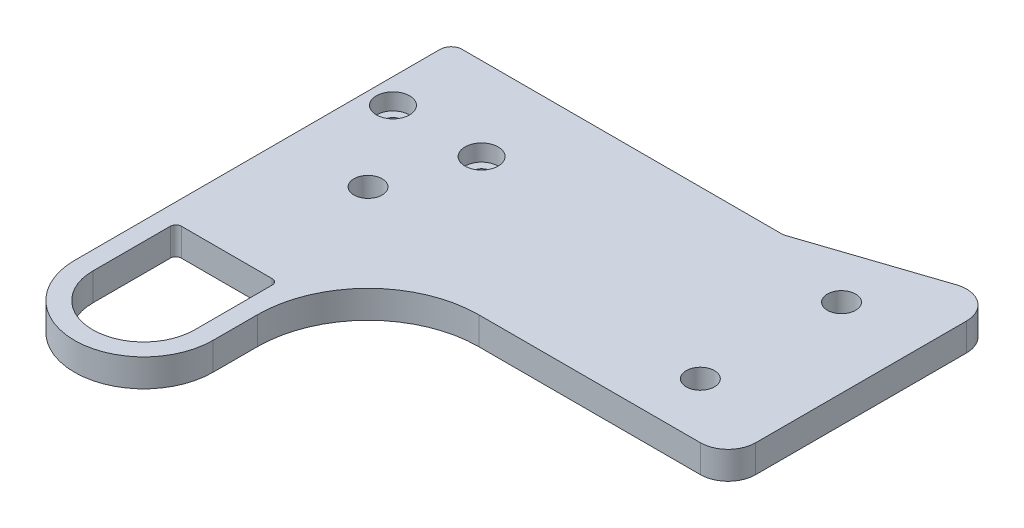
ISO-10303-21;
HEADER;
FILE_DESCRIPTION(('STEP AP214'),'2;1');
FILE_NAME('part.step','',(''),(''),'','','');
FILE_SCHEMA(('AUTOMOTIVE_DESIGN { 1 0 10303 214 1 1 1 1 }'));
ENDSEC;
DATA;
#1=APPLICATION_CONTEXT('core data for automotive mechanical design processes');
#2=APPLICATION_PROTOCOL_DEFINITION('international standard','automotive_design',2000,#1);
#3=PRODUCT_CONTEXT('',#1,'mechanical');
#4=PRODUCT('Part','Part','',(#3));
#5=PRODUCT_RELATED_PRODUCT_CATEGORY('part','',(#4));
#6=PRODUCT_DEFINITION_FORMATION('','',#4);
#7=PRODUCT_DEFINITION_CONTEXT('part definition',#1,'design');
#8=PRODUCT_DEFINITION('design','',#6,#7);
#9=PRODUCT_DEFINITION_SHAPE('','',#8);
#10=(LENGTH_UNIT() NAMED_UNIT(*) SI_UNIT(.MILLI.,.METRE.));
#11=(NAMED_UNIT(*) PLANE_ANGLE_UNIT() SI_UNIT($,.RADIAN.));
#12=(NAMED_UNIT(*) SI_UNIT($,.STERADIAN.) SOLID_ANGLE_UNIT());
#13=UNCERTAINTY_MEASURE_WITH_UNIT(LENGTH_MEASURE(1.E-05),#10,'distance_accuracy_value','');
#14=(GEOMETRIC_REPRESENTATION_CONTEXT(3) GLOBAL_UNCERTAINTY_ASSIGNED_CONTEXT((#13)) GLOBAL_UNIT_ASSIGNED_CONTEXT((#10,
#11,#12)) REPRESENTATION_CONTEXT('',''));
#15=CARTESIAN_POINT('',(0.,0.,0.));
#16=DIRECTION('',(0.,0.,1.));
#17=DIRECTION('',(1.,0.,0.));
#18=AXIS2_PLACEMENT_3D('',#15,#16,#17);
#19=CARTESIAN_POINT('',(12.5,5.,48.));
#20=DIRECTION('',(0.,1.,0.));
#21=DIRECTION('',(0.,0.,1.));
#22=AXIS2_PLACEMENT_3D('',#19,#20,#21);
#23=PLANE('',#22);
#24=CARTESIAN_POINT('',(4.50000000000001,5.,-4.99999999999998));
#25=DIRECTION('',(0.,-1.,0.));
#26=DIRECTION('',(0.,0.,-1.));
#27=AXIS2_PLACEMENT_3D('',#24,#25,#26);
#28=CIRCLE('',#27,3.);
#29=CARTESIAN_POINT('',(4.50000000000001,5.,-7.99999999999998));
#30=VERTEX_POINT('',#29);
#31=EDGE_CURVE('E390',#30,#30,#28,.T.);
#32=ORIENTED_EDGE('',*,*,#31,.T.);
#33=EDGE_LOOP('',(#32));
#34=FACE_BOUND('',#33,.T.);
#35=CARTESIAN_POINT('',(20.5,5.,-4.99999999999998));
#36=DIRECTION('',(0.,-1.,0.));
#37=DIRECTION('',(0.,0.,-1.));
#38=AXIS2_PLACEMENT_3D('',#35,#36,#37);
#39=CIRCLE('',#38,3.);
#40=CARTESIAN_POINT('',(20.5,5.,-7.99999999999998));
#41=VERTEX_POINT('',#40);
#42=EDGE_CURVE('E402',#41,#41,#39,.T.);
#43=ORIENTED_EDGE('',*,*,#42,.T.);
#44=EDGE_LOOP('',(#43));
#45=FACE_BOUND('',#44,.T.);
#46=CARTESIAN_POINT('',(4.30000000000001,5.,34.));
#47=DIRECTION('',(0.,1.,0.));
#48=DIRECTION('',(0.,0.,-1.));
#49=AXIS2_PLACEMENT_3D('',#46,#47,#48);
#50=CIRCLE('',#49,1.);
#51=CARTESIAN_POINT('',(4.30000000000001,5.,33.));
#52=VERTEX_POINT('',#51);
#53=CARTESIAN_POINT('',(3.30000000000001,5.,34.));
#54=VERTEX_POINT('',#53);
#55=EDGE_CURVE('E172',#52,#54,#50,.T.);
#56=ORIENTED_EDGE('',*,*,#55,.F.);
#57=DIRECTION('',(-1.,0.,0.));
#58=VECTOR('',#57,1.);
#59=CARTESIAN_POINT('',(4.30000000000001,5.,33.));
#60=LINE('',#59,#58);
#61=CARTESIAN_POINT('',(20.7,5.,33.));
#62=VERTEX_POINT('',#61);
#63=EDGE_CURVE('E194',#62,#52,#60,.T.);
#64=ORIENTED_EDGE('',*,*,#63,.F.);
#65=CARTESIAN_POINT('',(20.7,5.,34.));
#66=DIRECTION('',(0.,1.,0.));
#67=DIRECTION('',(0.,0.,-1.));
#68=AXIS2_PLACEMENT_3D('',#65,#66,#67);
#69=CIRCLE('',#68,1.);
#70=CARTESIAN_POINT('',(21.7,5.,34.));
#71=VERTEX_POINT('',#70);
#72=EDGE_CURVE('E198',#71,#62,#69,.T.);
#73=ORIENTED_EDGE('',*,*,#72,.F.);
#74=DIRECTION('',(0.,0.,-1.));
#75=VECTOR('',#74,1.);
#76=CARTESIAN_POINT('',(21.7,5.,34.));
#77=LINE('',#76,#75);
#78=CARTESIAN_POINT('',(21.7,5.,48.));
#79=VERTEX_POINT('',#78);
#80=EDGE_CURVE('E224',#79,#71,#77,.T.);
#81=ORIENTED_EDGE('',*,*,#80,.F.);
#82=CARTESIAN_POINT('',(12.5,5.,48.));
#83=DIRECTION('',(0.,1.,0.));
#84=DIRECTION('',(0.,0.,1.));
#85=AXIS2_PLACEMENT_3D('',#82,#83,#84);
#86=CIRCLE('',#85,9.2);
#87=CARTESIAN_POINT('',(3.30000000000001,5.,48.));
#88=VERTEX_POINT('',#87);
#89=EDGE_CURVE('E220',#88,#79,#86,.T.);
#90=ORIENTED_EDGE('',*,*,#89,.F.);
#91=DIRECTION('',(0.,0.,1.));
#92=VECTOR('',#91,1.);
#93=CARTESIAN_POINT('',(3.30000000000001,5.,48.));
#94=LINE('',#93,#92);
#95=EDGE_CURVE('E217',#54,#88,#94,.T.);
#96=ORIENTED_EDGE('',*,*,#95,.F.);
#97=EDGE_LOOP('',(#56,#64,#73,#81,#90,#96));
#98=FACE_BOUND('',#97,.T.);
#99=CARTESIAN_POINT('',(15.,5.,10.));
#100=DIRECTION('',(0.,1.,0.));
#101=DIRECTION('',(0.,0.,1.));
#102=AXIS2_PLACEMENT_3D('',#99,#100,#101);
#103=CIRCLE('',#102,2.55);
#104=CARTESIAN_POINT('',(15.,5.,12.55));
#105=VERTEX_POINT('',#104);
#106=EDGE_CURVE('E246',#105,#105,#103,.T.);
#107=ORIENTED_EDGE('',*,*,#106,.F.);
#108=EDGE_LOOP('',(#107));
#109=FACE_BOUND('',#108,.T.);
#110=CARTESIAN_POINT('',(75.7697505292423,5.,-14.7156579758528));
#111=DIRECTION('',(0.,1.,0.));
#112=DIRECTION('',(0.,0.,1.));
#113=AXIS2_PLACEMENT_3D('',#110,#111,#112);
#114=CIRCLE('',#113,2.54999999999999);
#115=CARTESIAN_POINT('',(75.7697505292423,5.,-12.1656579758528));
#116=VERTEX_POINT('',#115);
#117=EDGE_CURVE('E262',#116,#116,#114,.T.);
#118=ORIENTED_EDGE('',*,*,#117,.F.);
#119=EDGE_LOOP('',(#118));
#120=FACE_BOUND('',#119,.T.);
#121=DIRECTION('',(-1.,0.,0.));
#122=VECTOR('',#121,1.);
#123=CARTESIAN_POINT('',(0.,5.,-20.));
#124=LINE('',#123,#122);
#125=CARTESIAN_POINT('',(59.6754446796633,5.,-20.));
#126=VERTEX_POINT('',#125);
#127=CARTESIAN_POINT('',(2.,5.,-20.));
#128=VERTEX_POINT('',#127);
#129=EDGE_CURVE('E410',#126,#128,#124,.T.);
#130=ORIENTED_EDGE('',*,*,#129,.T.);
#131=CARTESIAN_POINT('',(2.,5.,-18.));
#132=DIRECTION('',(0.,1.,0.));
#133=DIRECTION('',(0.,0.,1.));
#134=AXIS2_PLACEMENT_3D('',#131,#132,#133);
#135=CIRCLE('',#134,2.);
#136=CARTESIAN_POINT('',(0.,5.,-18.));
#137=VERTEX_POINT('',#136);
#138=EDGE_CURVE('E64',#128,#137,#135,.T.);
#139=ORIENTED_EDGE('',*,*,#138,.T.);
#140=DIRECTION('',(0.,0.,1.));
#141=VECTOR('',#140,1.);
#142=CARTESIAN_POINT('',(0.,5.,0.));
#143=LINE('',#142,#141);
#144=CARTESIAN_POINT('',(0.,5.,48.));
#145=VERTEX_POINT('',#144);
#146=EDGE_CURVE('E274',#137,#145,#143,.T.);
#147=ORIENTED_EDGE('',*,*,#146,.T.);
#148=CARTESIAN_POINT('',(12.5,5.,48.));
#149=DIRECTION('',(0.,1.,0.));
#150=DIRECTION('',(0.,0.,1.));
#151=AXIS2_PLACEMENT_3D('',#148,#149,#150);
#152=CIRCLE('',#151,12.5);
#153=CARTESIAN_POINT('',(25.,5.,48.));
#154=VERTEX_POINT('',#153);
#155=EDGE_CURVE('E278',#145,#154,#152,.T.);
#156=ORIENTED_EDGE('',*,*,#155,.T.);
#157=DIRECTION('',(0.,0.,-1.));
#158=VECTOR('',#157,1.);
#159=CARTESIAN_POINT('',(25.,5.,48.));
#160=LINE('',#159,#158);
#161=CARTESIAN_POINT('',(25.,5.,40.));
#162=VERTEX_POINT('',#161);
#163=EDGE_CURVE('E281',#154,#162,#160,.T.);
#164=ORIENTED_EDGE('',*,*,#163,.T.);
#165=CARTESIAN_POINT('',(45.,5.,40.));
#166=DIRECTION('',(0.,1.,0.));
#167=DIRECTION('',(0.,0.,1.));
#168=AXIS2_PLACEMENT_3D('',#165,#166,#167);
#169=CIRCLE('',#168,20.);
#170=CARTESIAN_POINT('',(45.,5.,20.));
#171=VERTEX_POINT('',#170);
#172=EDGE_CURVE('E331',#162,#171,#169,.F.);
#173=ORIENTED_EDGE('',*,*,#172,.T.);
#174=DIRECTION('',(1.,0.,0.));
#175=VECTOR('',#174,1.);
#176=CARTESIAN_POINT('',(90.,5.,20.));
#177=LINE('',#176,#175);
#178=CARTESIAN_POINT('',(85.,5.,20.));
#179=VERTEX_POINT('',#178);
#180=EDGE_CURVE('E285',#171,#179,#177,.T.);
#181=ORIENTED_EDGE('',*,*,#180,.T.);
#182=CARTESIAN_POINT('',(85.,5.,15.));
#183=DIRECTION('',(0.,1.,0.));
#184=DIRECTION('',(0.,0.,1.));
#185=AXIS2_PLACEMENT_3D('',#182,#183,#184);
#186=CIRCLE('',#185,5.);
#187=CARTESIAN_POINT('',(90.,5.,15.));
#188=VERTEX_POINT('',#187);
#189=EDGE_CURVE('E353',#179,#188,#186,.T.);
#190=ORIENTED_EDGE('',*,*,#189,.T.);
#191=DIRECTION('',(0.,0.,-1.));
#192=VECTOR('',#191,1.);
#193=CARTESIAN_POINT('',(90.,5.,-30.));
#194=LINE('',#193,#192);
#195=CARTESIAN_POINT('',(90.,5.,-23.062870566386));
#196=VERTEX_POINT('',#195);
#197=EDGE_CURVE('E289',#188,#196,#194,.T.);
#198=ORIENTED_EDGE('',*,*,#197,.T.);
#199=CARTESIAN_POINT('',(85.,5.,-23.062870566386));
#200=DIRECTION('',(0.,1.,0.));
#201=DIRECTION('',(0.,0.,1.));
#202=AXIS2_PLACEMENT_3D('',#199,#200,#201);
#203=CIRCLE('',#202,5.);
#204=CARTESIAN_POINT('',(83.4188611699158,5.,-27.8062870566386));
#205=VERTEX_POINT('',#204);
#206=EDGE_CURVE('E350',#196,#205,#203,.T.);
#207=ORIENTED_EDGE('',*,*,#206,.T.);
#208=DIRECTION('',(-0.948683298050514,0.,0.316227766016838));
#209=VECTOR('',#208,1.);
#210=CARTESIAN_POINT('',(0.,5.,0.));
#211=LINE('',#210,#209);
#212=CARTESIAN_POINT('',(60.3079002116969,5.,-20.102633403899));
#213=VERTEX_POINT('',#212);
#214=EDGE_CURVE('E270',#205,#213,#211,.T.);
#215=ORIENTED_EDGE('',*,*,#214,.T.);
#216=CARTESIAN_POINT('',(59.6754446796633,5.,-22.));
#217=DIRECTION('',(0.,1.,0.));
#218=DIRECTION('',(0.,0.,1.));
#219=AXIS2_PLACEMENT_3D('',#216,#217,#218);
#220=CIRCLE('',#219,2.);
#221=EDGE_CURVE('E48',#213,#126,#220,.F.);
#222=ORIENTED_EDGE('',*,*,#221,.T.);
#223=EDGE_LOOP('',(#130,#139,#147,#156,#164,#173,#181,#190,#198,#207,#215,#222));
#224=FACE_BOUND('',#223,.T.);
#225=CARTESIAN_POINT('',(75.,5.,10.));
#226=DIRECTION('',(0.,1.,0.));
#227=DIRECTION('',(0.,0.,1.));
#228=AXIS2_PLACEMENT_3D('',#225,#226,#227);
#229=CIRCLE('',#228,2.54999999999999);
#230=CARTESIAN_POINT('',(75.,5.,12.55));
#231=VERTEX_POINT('',#230);
#232=EDGE_CURVE('E254',#231,#231,#229,.T.);
#233=ORIENTED_EDGE('',*,*,#232,.F.);
#234=EDGE_LOOP('',(#233));
#235=FACE_BOUND('',#234,.T.);
#236=ADVANCED_FACE('F38',(#34,#45,#98,#109,#120,#224,#235),#23,.T.);
#237=CARTESIAN_POINT('',(12.5,0.,48.));
#238=DIRECTION('',(0.,1.,0.));
#239=DIRECTION('',(0.,0.,1.));
#240=AXIS2_PLACEMENT_3D('',#237,#238,#239);
#241=PLANE('',#240);
#242=CARTESIAN_POINT('',(20.5,0.,-4.99999999999998));
#243=DIRECTION('',(0.,1.,0.));
#244=DIRECTION('',(0.,0.,1.));
#245=AXIS2_PLACEMENT_3D('',#242,#243,#244);
#246=CIRCLE('',#245,1.55);
#247=CARTESIAN_POINT('',(20.5,0.,-3.44999999999999));
#248=VERTEX_POINT('',#247);
#249=EDGE_CURVE('E406',#248,#248,#246,.T.);
#250=ORIENTED_EDGE('',*,*,#249,.T.);
#251=EDGE_LOOP('',(#250));
#252=FACE_BOUND('',#251,.T.);
#253=CARTESIAN_POINT('',(4.50000000000001,0.,-4.99999999999998));
#254=DIRECTION('',(0.,1.,0.));
#255=DIRECTION('',(0.,0.,-1.));
#256=AXIS2_PLACEMENT_3D('',#253,#254,#255);
#257=CIRCLE('',#256,1.55);
#258=CARTESIAN_POINT('',(4.50000000000001,0.,-6.54999999999998));
#259=VERTEX_POINT('',#258);
#260=EDGE_CURVE('E388',#259,#259,#257,.T.);
#261=ORIENTED_EDGE('',*,*,#260,.T.);
#262=EDGE_LOOP('',(#261));
#263=FACE_BOUND('',#262,.T.);
#264=DIRECTION('',(-1.,0.,0.));
#265=VECTOR('',#264,1.);
#266=CARTESIAN_POINT('',(4.30000000000001,0.,33.));
#267=LINE('',#266,#265);
#268=CARTESIAN_POINT('',(20.7,0.,33.));
#269=VERTEX_POINT('',#268);
#270=CARTESIAN_POINT('',(4.30000000000001,0.,33.));
#271=VERTEX_POINT('',#270);
#272=EDGE_CURVE('E178',#269,#271,#267,.T.);
#273=ORIENTED_EDGE('',*,*,#272,.T.);
#274=CARTESIAN_POINT('',(4.30000000000001,0.,34.));
#275=DIRECTION('',(0.,1.,0.));
#276=DIRECTION('',(0.,0.,-1.));
#277=AXIS2_PLACEMENT_3D('',#274,#275,#276);
#278=CIRCLE('',#277,1.);
#279=CARTESIAN_POINT('',(3.30000000000001,0.,34.));
#280=VERTEX_POINT('',#279);
#281=EDGE_CURVE('E169',#271,#280,#278,.T.);
#282=ORIENTED_EDGE('',*,*,#281,.T.);
#283=DIRECTION('',(0.,0.,1.));
#284=VECTOR('',#283,1.);
#285=CARTESIAN_POINT('',(3.30000000000001,0.,48.));
#286=LINE('',#285,#284);
#287=CARTESIAN_POINT('',(3.30000000000001,0.,48.));
#288=VERTEX_POINT('',#287);
#289=EDGE_CURVE('E182',#280,#288,#286,.T.);
#290=ORIENTED_EDGE('',*,*,#289,.T.);
#291=CARTESIAN_POINT('',(12.5,0.,48.));
#292=DIRECTION('',(0.,1.,0.));
#293=DIRECTION('',(0.,0.,1.));
#294=AXIS2_PLACEMENT_3D('',#291,#292,#293);
#295=CIRCLE('',#294,9.2);
#296=CARTESIAN_POINT('',(21.7,0.,48.));
#297=VERTEX_POINT('',#296);
#298=EDGE_CURVE('E187',#288,#297,#295,.T.);
#299=ORIENTED_EDGE('',*,*,#298,.T.);
#300=DIRECTION('',(0.,0.,-1.));
#301=VECTOR('',#300,1.);
#302=CARTESIAN_POINT('',(21.7,0.,34.));
#303=LINE('',#302,#301);
#304=CARTESIAN_POINT('',(21.7,0.,34.));
#305=VERTEX_POINT('',#304);
#306=EDGE_CURVE('E206',#297,#305,#303,.T.);
#307=ORIENTED_EDGE('',*,*,#306,.T.);
#308=CARTESIAN_POINT('',(20.7,0.,34.));
#309=DIRECTION('',(0.,1.,0.));
#310=DIRECTION('',(0.,0.,-1.));
#311=AXIS2_PLACEMENT_3D('',#308,#309,#310);
#312=CIRCLE('',#311,1.);
#313=EDGE_CURVE('E210',#305,#269,#312,.T.);
#314=ORIENTED_EDGE('',*,*,#313,.T.);
#315=EDGE_LOOP('',(#273,#282,#290,#299,#307,#314));
#316=FACE_BOUND('',#315,.T.);
#317=DIRECTION('',(0.,0.,1.));
#318=VECTOR('',#317,1.);
#319=CARTESIAN_POINT('',(0.,0.,0.));
#320=LINE('',#319,#318);
#321=CARTESIAN_POINT('',(0.,0.,-18.));
#322=VERTEX_POINT('',#321);
#323=CARTESIAN_POINT('',(0.,0.,48.));
#324=VERTEX_POINT('',#323);
#325=EDGE_CURVE('E297',#322,#324,#320,.T.);
#326=ORIENTED_EDGE('',*,*,#325,.F.);
#327=CARTESIAN_POINT('',(2.,0.,-18.));
#328=DIRECTION('',(0.,1.,0.));
#329=DIRECTION('',(0.,0.,1.));
#330=AXIS2_PLACEMENT_3D('',#327,#328,#329);
#331=CIRCLE('',#330,2.);
#332=CARTESIAN_POINT('',(2.,0.,-20.));
#333=VERTEX_POINT('',#332);
#334=EDGE_CURVE('E375',#322,#333,#331,.F.);
#335=ORIENTED_EDGE('',*,*,#334,.T.);
#336=DIRECTION('',(1.,0.,0.));
#337=VECTOR('',#336,1.);
#338=CARTESIAN_POINT('',(0.,0.,-20.));
#339=LINE('',#338,#337);
#340=CARTESIAN_POINT('',(59.6754446796633,0.,-20.));
#341=VERTEX_POINT('',#340);
#342=EDGE_CURVE('E201',#333,#341,#339,.T.);
#343=ORIENTED_EDGE('',*,*,#342,.T.);
#344=CARTESIAN_POINT('',(59.6754446796633,0.,-22.));
#345=DIRECTION('',(0.,1.,0.));
#346=DIRECTION('',(0.,0.,1.));
#347=AXIS2_PLACEMENT_3D('',#344,#345,#346);
#348=CIRCLE('',#347,2.);
#349=CARTESIAN_POINT('',(60.3079002116969,0.,-20.102633403899));
#350=VERTEX_POINT('',#349);
#351=EDGE_CURVE('E11',#341,#350,#348,.T.);
#352=ORIENTED_EDGE('',*,*,#351,.T.);
#353=DIRECTION('',(-0.948683298050514,0.,0.316227766016838));
#354=VECTOR('',#353,1.);
#355=CARTESIAN_POINT('',(0.,0.,0.));
#356=LINE('',#355,#354);
#357=CARTESIAN_POINT('',(83.4188611699158,0.,-27.8062870566386));
#358=VERTEX_POINT('',#357);
#359=EDGE_CURVE('E266',#358,#350,#356,.T.);
#360=ORIENTED_EDGE('',*,*,#359,.F.);
#361=CARTESIAN_POINT('',(85.,0.,-23.062870566386));
#362=DIRECTION('',(0.,1.,0.));
#363=DIRECTION('',(0.,0.,1.));
#364=AXIS2_PLACEMENT_3D('',#361,#362,#363);
#365=CIRCLE('',#364,5.);
#366=CARTESIAN_POINT('',(90.,0.,-23.062870566386));
#367=VERTEX_POINT('',#366);
#368=EDGE_CURVE('E341',#358,#367,#365,.F.);
#369=ORIENTED_EDGE('',*,*,#368,.T.);
#370=DIRECTION('',(0.,0.,-1.));
#371=VECTOR('',#370,1.);
#372=CARTESIAN_POINT('',(90.,0.,-30.));
#373=LINE('',#372,#371);
#374=CARTESIAN_POINT('',(90.,0.,15.));
#375=VERTEX_POINT('',#374);
#376=EDGE_CURVE('E275',#375,#367,#373,.T.);
#377=ORIENTED_EDGE('',*,*,#376,.F.);
#378=CARTESIAN_POINT('',(85.,0.,15.));
#379=DIRECTION('',(0.,1.,0.));
#380=DIRECTION('',(0.,0.,1.));
#381=AXIS2_PLACEMENT_3D('',#378,#379,#380);
#382=CIRCLE('',#381,5.);
#383=CARTESIAN_POINT('',(85.,0.,20.));
#384=VERTEX_POINT('',#383);
#385=EDGE_CURVE('E344',#375,#384,#382,.F.);
#386=ORIENTED_EDGE('',*,*,#385,.T.);
#387=DIRECTION('',(1.,0.,0.));
#388=VECTOR('',#387,1.);
#389=CARTESIAN_POINT('',(90.,0.,20.));
#390=LINE('',#389,#388);
#391=CARTESIAN_POINT('',(45.,0.,20.));
#392=VERTEX_POINT('',#391);
#393=EDGE_CURVE('E307',#392,#384,#390,.T.);
#394=ORIENTED_EDGE('',*,*,#393,.F.);
#395=CARTESIAN_POINT('',(45.,0.,40.));
#396=DIRECTION('',(0.,1.,0.));
#397=DIRECTION('',(0.,0.,1.));
#398=AXIS2_PLACEMENT_3D('',#395,#396,#397);
#399=CIRCLE('',#398,20.);
#400=CARTESIAN_POINT('',(25.,0.,40.));
#401=VERTEX_POINT('',#400);
#402=EDGE_CURVE('E328',#392,#401,#399,.T.);
#403=ORIENTED_EDGE('',*,*,#402,.T.);
#404=DIRECTION('',(0.,0.,-1.));
#405=VECTOR('',#404,1.);
#406=CARTESIAN_POINT('',(25.,0.,48.));
#407=LINE('',#406,#405);
#408=CARTESIAN_POINT('',(25.,0.,48.));
#409=VERTEX_POINT('',#408);
#410=EDGE_CURVE('E303',#409,#401,#407,.T.);
#411=ORIENTED_EDGE('',*,*,#410,.F.);
#412=CARTESIAN_POINT('',(12.5,0.,48.));
#413=DIRECTION('',(0.,1.,0.));
#414=DIRECTION('',(0.,0.,1.));
#415=AXIS2_PLACEMENT_3D('',#412,#413,#414);
#416=CIRCLE('',#415,12.5);
#417=EDGE_CURVE('E300',#324,#409,#416,.T.);
#418=ORIENTED_EDGE('',*,*,#417,.F.);
#419=EDGE_LOOP('',(#326,#335,#343,#352,#360,#369,#377,#386,#394,#403,#411,#418));
#420=FACE_BOUND('',#419,.T.);
#421=CARTESIAN_POINT('',(75.7697505292423,0.,-14.7156579758528));
#422=DIRECTION('',(0.,1.,0.));
#423=DIRECTION('',(0.,0.,1.));
#424=AXIS2_PLACEMENT_3D('',#421,#422,#423);
#425=CIRCLE('',#424,2.54999999999999);
#426=CARTESIAN_POINT('',(75.7697505292423,0.,-12.1656579758528));
#427=VERTEX_POINT('',#426);
#428=EDGE_CURVE('E258',#427,#427,#425,.T.);
#429=ORIENTED_EDGE('',*,*,#428,.T.);
#430=EDGE_LOOP('',(#429));
#431=FACE_BOUND('',#430,.T.);
#432=CARTESIAN_POINT('',(75.,0.,10.));
#433=DIRECTION('',(0.,1.,0.));
#434=DIRECTION('',(0.,0.,1.));
#435=AXIS2_PLACEMENT_3D('',#432,#433,#434);
#436=CIRCLE('',#435,2.54999999999999);
#437=CARTESIAN_POINT('',(75.,0.,12.55));
#438=VERTEX_POINT('',#437);
#439=EDGE_CURVE('E250',#438,#438,#436,.T.);
#440=ORIENTED_EDGE('',*,*,#439,.T.);
#441=EDGE_LOOP('',(#440));
#442=FACE_BOUND('',#441,.T.);
#443=CARTESIAN_POINT('',(15.,0.,10.));
#444=DIRECTION('',(0.,1.,0.));
#445=DIRECTION('',(0.,0.,1.));
#446=AXIS2_PLACEMENT_3D('',#443,#444,#445);
#447=CIRCLE('',#446,2.55);
#448=CARTESIAN_POINT('',(15.,0.,12.55));
#449=VERTEX_POINT('',#448);
#450=EDGE_CURVE('E234',#449,#449,#447,.T.);
#451=ORIENTED_EDGE('',*,*,#450,.T.);
#452=EDGE_LOOP('',(#451));
#453=FACE_BOUND('',#452,.T.);
#454=ADVANCED_FACE('F189',(#252,#263,#316,#420,#431,#442,#453),#241,.F.);
#455=CARTESIAN_POINT('',(0.,5.,0.));
#456=DIRECTION('',(0.316227766016838,0.,0.948683298050514));
#457=DIRECTION('',(0.948683298050514,0.,-0.316227766016838));
#458=AXIS2_PLACEMENT_3D('',#455,#456,#457);
#459=PLANE('',#458);
#460=ORIENTED_EDGE('',*,*,#359,.T.);
#461=DIRECTION('',(0.,1.,0.));
#462=VECTOR('',#461,1.);
#463=CARTESIAN_POINT('',(60.3079002116969,5.,-20.102633403899));
#464=LINE('',#463,#462);
#465=EDGE_CURVE('E360',#350,#213,#464,.T.);
#466=ORIENTED_EDGE('',*,*,#465,.T.);
#467=ORIENTED_EDGE('',*,*,#214,.F.);
#468=DIRECTION('',(0.,-1.,0.));
#469=VECTOR('',#468,1.);
#470=CARTESIAN_POINT('',(83.4188611699158,5.,-27.8062870566386));
#471=LINE('',#470,#469);
#472=EDGE_CURVE('E356',#205,#358,#471,.T.);
#473=ORIENTED_EDGE('',*,*,#472,.T.);
#474=EDGE_LOOP('',(#460,#466,#467,#473));
#475=FACE_BOUND('',#474,.T.);
#476=ADVANCED_FACE('F430',(#475),#459,.F.);
#477=CARTESIAN_POINT('',(0.,5.,0.));
#478=DIRECTION('',(1.,0.,0.));
#479=DIRECTION('',(0.,0.,-1.));
#480=AXIS2_PLACEMENT_3D('',#477,#478,#479);
#481=PLANE('',#480);
#482=ORIENTED_EDGE('',*,*,#146,.F.);
#483=DIRECTION('',(0.,1.,0.));
#484=VECTOR('',#483,1.);
#485=CARTESIAN_POINT('',(0.,0.,-18.));
#486=LINE('',#485,#484);
#487=EDGE_CURVE('E56',#137,#322,#486,.F.);
#488=ORIENTED_EDGE('',*,*,#487,.T.);
#489=ORIENTED_EDGE('',*,*,#325,.T.);
#490=DIRECTION('',(0.,-1.,0.));
#491=VECTOR('',#490,1.);
#492=CARTESIAN_POINT('',(0.,5.,48.));
#493=LINE('',#492,#491);
#494=EDGE_CURVE('E317',#145,#324,#493,.T.);
#495=ORIENTED_EDGE('',*,*,#494,.F.);
#496=EDGE_LOOP('',(#482,#488,#489,#495));
#497=FACE_BOUND('',#496,.T.);
#498=ADVANCED_FACE('F503',(#497),#481,.F.);
#499=CARTESIAN_POINT('',(12.5,5.,48.));
#500=DIRECTION('',(0.,-1.,0.));
#501=DIRECTION('',(0.,0.,-1.));
#502=AXIS2_PLACEMENT_3D('',#499,#500,#501);
#503=CYLINDRICAL_SURFACE('',#502,12.5);
#504=ORIENTED_EDGE('',*,*,#417,.T.);
#505=DIRECTION('',(0.,-1.,0.));
#506=VECTOR('',#505,1.);
#507=CARTESIAN_POINT('',(25.,5.,48.));
#508=LINE('',#507,#506);
#509=EDGE_CURVE('E293',#154,#409,#508,.T.);
#510=ORIENTED_EDGE('',*,*,#509,.F.);
#511=ORIENTED_EDGE('',*,*,#155,.F.);
#512=ORIENTED_EDGE('',*,*,#494,.T.);
#513=EDGE_LOOP('',(#504,#510,#511,#512));
#514=FACE_BOUND('',#513,.T.);
#515=ADVANCED_FACE('F463',(#514),#503,.T.);
#516=CARTESIAN_POINT('',(25.,5.,48.));
#517=DIRECTION('',(-1.,0.,0.));
#518=DIRECTION('',(0.,0.,1.));
#519=AXIS2_PLACEMENT_3D('',#516,#517,#518);
#520=PLANE('',#519);
#521=ORIENTED_EDGE('',*,*,#410,.T.);
#522=DIRECTION('',(0.,-1.,0.));
#523=VECTOR('',#522,1.);
#524=CARTESIAN_POINT('',(25.,5.,40.));
#525=LINE('',#524,#523);
#526=EDGE_CURVE('E325',#401,#162,#525,.F.);
#527=ORIENTED_EDGE('',*,*,#526,.T.);
#528=ORIENTED_EDGE('',*,*,#163,.F.);
#529=ORIENTED_EDGE('',*,*,#509,.T.);
#530=EDGE_LOOP('',(#521,#527,#528,#529));
#531=FACE_BOUND('',#530,.T.);
#532=ADVANCED_FACE('F458',(#531),#520,.F.);
#533=CARTESIAN_POINT('',(90.,5.,20.));
#534=DIRECTION('',(0.,0.,-1.));
#535=DIRECTION('',(-1.,0.,0.));
#536=AXIS2_PLACEMENT_3D('',#533,#534,#535);
#537=PLANE('',#536);
#538=ORIENTED_EDGE('',*,*,#393,.T.);
#539=DIRECTION('',(0.,-1.,0.));
#540=VECTOR('',#539,1.);
#541=CARTESIAN_POINT('',(85.,5.,20.));
#542=LINE('',#541,#540);
#543=EDGE_CURVE('E347',#384,#179,#542,.F.);
#544=ORIENTED_EDGE('',*,*,#543,.T.);
#545=ORIENTED_EDGE('',*,*,#180,.F.);
#546=DIRECTION('',(0.,-1.,0.));
#547=VECTOR('',#546,1.);
#548=CARTESIAN_POINT('',(45.,0.,20.));
#549=LINE('',#548,#547);
#550=EDGE_CURVE('E321',#171,#392,#549,.T.);
#551=ORIENTED_EDGE('',*,*,#550,.T.);
#552=EDGE_LOOP('',(#538,#544,#545,#551));
#553=FACE_BOUND('',#552,.T.);
#554=ADVANCED_FACE('F448',(#553),#537,.F.);
#555=CARTESIAN_POINT('',(90.,5.,-30.));
#556=DIRECTION('',(-1.,0.,0.));
#557=DIRECTION('',(0.,0.,1.));
#558=AXIS2_PLACEMENT_3D('',#555,#556,#557);
#559=PLANE('',#558);
#560=ORIENTED_EDGE('',*,*,#197,.F.);
#561=DIRECTION('',(0.,-1.,0.));
#562=VECTOR('',#561,1.);
#563=CARTESIAN_POINT('',(90.,5.,15.));
#564=LINE('',#563,#562);
#565=EDGE_CURVE('E337',#188,#375,#564,.T.);
#566=ORIENTED_EDGE('',*,*,#565,.T.);
#567=ORIENTED_EDGE('',*,*,#376,.T.);
#568=DIRECTION('',(0.,-1.,0.));
#569=VECTOR('',#568,1.);
#570=CARTESIAN_POINT('',(90.,5.,-23.062870566386));
#571=LINE('',#570,#569);
#572=EDGE_CURVE('E334',#367,#196,#571,.F.);
#573=ORIENTED_EDGE('',*,*,#572,.T.);
#574=EDGE_LOOP('',(#560,#566,#567,#573));
#575=FACE_BOUND('',#574,.T.);
#576=ADVANCED_FACE('F440',(#575),#559,.F.);
#577=CARTESIAN_POINT('',(75.7697505292423,5.,-14.7156579758528));
#578=DIRECTION('',(0.,-1.,0.));
#579=DIRECTION('',(0.,0.,-1.));
#580=AXIS2_PLACEMENT_3D('',#577,#578,#579);
#581=CYLINDRICAL_SURFACE('',#580,2.54999999999999);
#582=ORIENTED_EDGE('',*,*,#117,.T.);
#583=EDGE_LOOP('',(#582));
#584=FACE_BOUND('',#583,.T.);
#585=ORIENTED_EDGE('',*,*,#428,.F.);
#586=EDGE_LOOP('',(#585));
#587=FACE_BOUND('',#586,.T.);
#588=ADVANCED_FACE('F492',(#584,#587),#581,.F.);
#589=CARTESIAN_POINT('',(75.,5.,10.));
#590=DIRECTION('',(0.,-1.,0.));
#591=DIRECTION('',(0.,0.,-1.));
#592=AXIS2_PLACEMENT_3D('',#589,#590,#591);
#593=CYLINDRICAL_SURFACE('',#592,2.54999999999999);
#594=ORIENTED_EDGE('',*,*,#232,.T.);
#595=EDGE_LOOP('',(#594));
#596=FACE_BOUND('',#595,.T.);
#597=ORIENTED_EDGE('',*,*,#439,.F.);
#598=EDGE_LOOP('',(#597));
#599=FACE_BOUND('',#598,.T.);
#600=ADVANCED_FACE('F682',(#596,#599),#593,.F.);
#601=CARTESIAN_POINT('',(15.,5.,10.));
#602=DIRECTION('',(0.,-1.,0.));
#603=DIRECTION('',(0.,0.,-1.));
#604=AXIS2_PLACEMENT_3D('',#601,#602,#603);
#605=CYLINDRICAL_SURFACE('',#604,2.55);
#606=ORIENTED_EDGE('',*,*,#106,.T.);
#607=EDGE_LOOP('',(#606));
#608=FACE_BOUND('',#607,.T.);
#609=ORIENTED_EDGE('',*,*,#450,.F.);
#610=EDGE_LOOP('',(#609));
#611=FACE_BOUND('',#610,.T.);
#612=ADVANCED_FACE('F510',(#608,#611),#605,.F.);
#613=CARTESIAN_POINT('',(45.,5.,40.));
#614=DIRECTION('',(0.,1.,0.));
#615=DIRECTION('',(0.,0.,1.));
#616=AXIS2_PLACEMENT_3D('',#613,#614,#615);
#617=CYLINDRICAL_SURFACE('',#616,20.);
#618=ORIENTED_EDGE('',*,*,#172,.F.);
#619=ORIENTED_EDGE('',*,*,#526,.F.);
#620=ORIENTED_EDGE('',*,*,#402,.F.);
#621=ORIENTED_EDGE('',*,*,#550,.F.);
#622=EDGE_LOOP('',(#618,#619,#620,#621));
#623=FACE_BOUND('',#622,.T.);
#624=ADVANCED_FACE('F453',(#623),#617,.F.);
#625=CARTESIAN_POINT('',(85.,5.,15.));
#626=DIRECTION('',(0.,-1.,0.));
#627=DIRECTION('',(0.,0.,-1.));
#628=AXIS2_PLACEMENT_3D('',#625,#626,#627);
#629=CYLINDRICAL_SURFACE('',#628,5.);
#630=ORIENTED_EDGE('',*,*,#189,.F.);
#631=ORIENTED_EDGE('',*,*,#543,.F.);
#632=ORIENTED_EDGE('',*,*,#385,.F.);
#633=ORIENTED_EDGE('',*,*,#565,.F.);
#634=EDGE_LOOP('',(#630,#631,#632,#633));
#635=FACE_BOUND('',#634,.T.);
#636=ADVANCED_FACE('F444',(#635),#629,.T.);
#637=CARTESIAN_POINT('',(85.,5.,-23.062870566386));
#638=DIRECTION('',(0.,-1.,0.));
#639=DIRECTION('',(0.,0.,-1.));
#640=AXIS2_PLACEMENT_3D('',#637,#638,#639);
#641=CYLINDRICAL_SURFACE('',#640,5.);
#642=ORIENTED_EDGE('',*,*,#206,.F.);
#643=ORIENTED_EDGE('',*,*,#572,.F.);
#644=ORIENTED_EDGE('',*,*,#368,.F.);
#645=ORIENTED_EDGE('',*,*,#472,.F.);
#646=EDGE_LOOP('',(#642,#643,#644,#645));
#647=FACE_BOUND('',#646,.T.);
#648=ADVANCED_FACE('F437',(#647),#641,.T.);
#649=CARTESIAN_POINT('',(4.30000000000001,0.,34.));
#650=DIRECTION('',(0.,1.,0.));
#651=DIRECTION('',(0.,0.,1.));
#652=AXIS2_PLACEMENT_3D('',#649,#650,#651);
#653=CYLINDRICAL_SURFACE('',#652,1.);
#654=ORIENTED_EDGE('',*,*,#55,.T.);
#655=DIRECTION('',(0.,1.,0.));
#656=VECTOR('',#655,1.);
#657=CARTESIAN_POINT('',(3.30000000000001,0.,34.));
#658=LINE('',#657,#656);
#659=EDGE_CURVE('E165',#280,#54,#658,.T.);
#660=ORIENTED_EDGE('',*,*,#659,.F.);
#661=ORIENTED_EDGE('',*,*,#281,.F.);
#662=DIRECTION('',(0.,1.,0.));
#663=VECTOR('',#662,1.);
#664=CARTESIAN_POINT('',(4.30000000000001,0.,33.));
#665=LINE('',#664,#663);
#666=EDGE_CURVE('E231',#271,#52,#665,.T.);
#667=ORIENTED_EDGE('',*,*,#666,.T.);
#668=EDGE_LOOP('',(#654,#660,#661,#667));
#669=FACE_BOUND('',#668,.T.);
#670=ADVANCED_FACE('F167',(#669),#653,.F.);
#671=CARTESIAN_POINT('',(4.30000000000001,0.,33.));
#672=DIRECTION('',(0.,0.,-1.));
#673=DIRECTION('',(-1.,0.,0.));
#674=AXIS2_PLACEMENT_3D('',#671,#672,#673);
#675=PLANE('',#674);
#676=ORIENTED_EDGE('',*,*,#63,.T.);
#677=ORIENTED_EDGE('',*,*,#666,.F.);
#678=ORIENTED_EDGE('',*,*,#272,.F.);
#679=DIRECTION('',(0.,1.,0.));
#680=VECTOR('',#679,1.);
#681=CARTESIAN_POINT('',(20.7,0.,33.));
#682=LINE('',#681,#680);
#683=EDGE_CURVE('E235',#269,#62,#682,.T.);
#684=ORIENTED_EDGE('',*,*,#683,.T.);
#685=EDGE_LOOP('',(#676,#677,#678,#684));
#686=FACE_BOUND('',#685,.T.);
#687=ADVANCED_FACE('F641',(#686),#675,.F.);
#688=CARTESIAN_POINT('',(20.7,0.,34.));
#689=DIRECTION('',(0.,1.,0.));
#690=DIRECTION('',(0.,0.,1.));
#691=AXIS2_PLACEMENT_3D('',#688,#689,#690);
#692=CYLINDRICAL_SURFACE('',#691,1.);
#693=ORIENTED_EDGE('',*,*,#72,.T.);
#694=ORIENTED_EDGE('',*,*,#683,.F.);
#695=ORIENTED_EDGE('',*,*,#313,.F.);
#696=DIRECTION('',(0.,1.,0.));
#697=VECTOR('',#696,1.);
#698=CARTESIAN_POINT('',(21.7,0.,34.));
#699=LINE('',#698,#697);
#700=EDGE_CURVE('E238',#305,#71,#699,.T.);
#701=ORIENTED_EDGE('',*,*,#700,.T.);
#702=EDGE_LOOP('',(#693,#694,#695,#701));
#703=FACE_BOUND('',#702,.T.);
#704=ADVANCED_FACE('F632',(#703),#692,.F.);
#705=CARTESIAN_POINT('',(21.7,0.,34.));
#706=DIRECTION('',(1.,0.,0.));
#707=DIRECTION('',(0.,0.,-1.));
#708=AXIS2_PLACEMENT_3D('',#705,#706,#707);
#709=PLANE('',#708);
#710=ORIENTED_EDGE('',*,*,#80,.T.);
#711=ORIENTED_EDGE('',*,*,#700,.F.);
#712=ORIENTED_EDGE('',*,*,#306,.F.);
#713=DIRECTION('',(0.,1.,0.));
#714=VECTOR('',#713,1.);
#715=CARTESIAN_POINT('',(21.7,0.,48.));
#716=LINE('',#715,#714);
#717=EDGE_CURVE('E241',#297,#79,#716,.T.);
#718=ORIENTED_EDGE('',*,*,#717,.T.);
#719=EDGE_LOOP('',(#710,#711,#712,#718));
#720=FACE_BOUND('',#719,.T.);
#721=ADVANCED_FACE('F623',(#720),#709,.F.);
#722=CARTESIAN_POINT('',(12.5,0.,48.));
#723=DIRECTION('',(0.,1.,0.));
#724=DIRECTION('',(0.,0.,1.));
#725=AXIS2_PLACEMENT_3D('',#722,#723,#724);
#726=CYLINDRICAL_SURFACE('',#725,9.2);
#727=ORIENTED_EDGE('',*,*,#89,.T.);
#728=ORIENTED_EDGE('',*,*,#717,.F.);
#729=ORIENTED_EDGE('',*,*,#298,.F.);
#730=DIRECTION('',(0.,1.,0.));
#731=VECTOR('',#730,1.);
#732=CARTESIAN_POINT('',(3.30000000000001,0.,48.));
#733=LINE('',#732,#731);
#734=EDGE_CURVE('E177',#288,#88,#733,.T.);
#735=ORIENTED_EDGE('',*,*,#734,.T.);
#736=EDGE_LOOP('',(#727,#728,#729,#735));
#737=FACE_BOUND('',#736,.T.);
#738=ADVANCED_FACE('F478',(#737),#726,.F.);
#739=CARTESIAN_POINT('',(3.30000000000001,0.,48.));
#740=DIRECTION('',(-1.,0.,0.));
#741=DIRECTION('',(0.,0.,1.));
#742=AXIS2_PLACEMENT_3D('',#739,#740,#741);
#743=PLANE('',#742);
#744=ORIENTED_EDGE('',*,*,#95,.T.);
#745=ORIENTED_EDGE('',*,*,#734,.F.);
#746=ORIENTED_EDGE('',*,*,#289,.F.);
#747=ORIENTED_EDGE('',*,*,#659,.T.);
#748=EDGE_LOOP('',(#744,#745,#746,#747));
#749=FACE_BOUND('',#748,.T.);
#750=ADVANCED_FACE('F183',(#749),#743,.F.);
#751=CARTESIAN_POINT('',(0.,-63.2455532033676,-20.));
#752=DIRECTION('',(0.,0.,-1.));
#753=DIRECTION('',(-1.,0.,0.));
#754=AXIS2_PLACEMENT_3D('',#751,#752,#753);
#755=PLANE('',#754);
#756=ORIENTED_EDGE('',*,*,#129,.F.);
#757=DIRECTION('',(0.,1.,0.));
#758=VECTOR('',#757,1.);
#759=CARTESIAN_POINT('',(59.6754446796633,-63.2455532033676,-20.));
#760=LINE('',#759,#758);
#761=EDGE_CURVE('E368',#126,#341,#760,.F.);
#762=ORIENTED_EDGE('',*,*,#761,.T.);
#763=ORIENTED_EDGE('',*,*,#342,.F.);
#764=DIRECTION('',(0.,1.,0.));
#765=VECTOR('',#764,1.);
#766=CARTESIAN_POINT('',(2.,5.,-20.));
#767=LINE('',#766,#765);
#768=EDGE_CURVE('E364',#333,#128,#767,.T.);
#769=ORIENTED_EDGE('',*,*,#768,.T.);
#770=EDGE_LOOP('',(#756,#762,#763,#769));
#771=FACE_BOUND('',#770,.T.);
#772=ADVANCED_FACE('F466',(#771),#755,.T.);
#773=CARTESIAN_POINT('',(4.50000000000001,0.,-4.99999999999998));
#774=DIRECTION('',(0.,1.,0.));
#775=DIRECTION('',(0.,0.,1.));
#776=AXIS2_PLACEMENT_3D('',#773,#774,#775);
#777=CYLINDRICAL_SURFACE('',#776,1.55);
#778=CARTESIAN_POINT('',(4.50000000000001,2.,-4.99999999999998));
#779=DIRECTION('',(0.,-1.,0.));
#780=DIRECTION('',(0.,0.,-1.));
#781=AXIS2_PLACEMENT_3D('',#778,#779,#780);
#782=CIRCLE('',#781,1.55);
#783=CARTESIAN_POINT('',(4.50000000000001,2.,-6.54999999999998));
#784=VERTEX_POINT('',#783);
#785=EDGE_CURVE('E42',#784,#784,#782,.F.);
#786=ORIENTED_EDGE('',*,*,#785,.T.);
#787=EDGE_LOOP('',(#786));
#788=FACE_BOUND('',#787,.T.);
#789=ORIENTED_EDGE('',*,*,#260,.F.);
#790=EDGE_LOOP('',(#789));
#791=FACE_BOUND('',#790,.T.);
#792=ADVANCED_FACE('F468',(#788,#791),#777,.F.);
#793=CARTESIAN_POINT('',(20.5,0.,-4.99999999999998));
#794=DIRECTION('',(0.,1.,0.));
#795=DIRECTION('',(0.,0.,1.));
#796=AXIS2_PLACEMENT_3D('',#793,#794,#795);
#797=CYLINDRICAL_SURFACE('',#796,1.55);
#798=CARTESIAN_POINT('',(20.5,2.,-4.99999999999998));
#799=DIRECTION('',(0.,-1.,0.));
#800=DIRECTION('',(0.,0.,-1.));
#801=AXIS2_PLACEMENT_3D('',#798,#799,#800);
#802=CIRCLE('',#801,1.55);
#803=CARTESIAN_POINT('',(20.5,2.,-6.54999999999998));
#804=VERTEX_POINT('',#803);
#805=EDGE_CURVE('E379',#804,#804,#802,.F.);
#806=ORIENTED_EDGE('',*,*,#805,.T.);
#807=EDGE_LOOP('',(#806));
#808=FACE_BOUND('',#807,.T.);
#809=ORIENTED_EDGE('',*,*,#249,.F.);
#810=EDGE_LOOP('',(#809));
#811=FACE_BOUND('',#810,.T.);
#812=ADVANCED_FACE('F475',(#808,#811),#797,.F.);
#813=CARTESIAN_POINT('',(59.6754446796633,5.,-22.));
#814=DIRECTION('',(0.,1.,0.));
#815=DIRECTION('',(0.,0.,1.));
#816=AXIS2_PLACEMENT_3D('',#813,#814,#815);
#817=CYLINDRICAL_SURFACE('',#816,2.);
#818=ORIENTED_EDGE('',*,*,#351,.F.);
#819=ORIENTED_EDGE('',*,*,#761,.F.);
#820=ORIENTED_EDGE('',*,*,#221,.F.);
#821=ORIENTED_EDGE('',*,*,#465,.F.);
#822=EDGE_LOOP('',(#818,#819,#820,#821));
#823=FACE_BOUND('',#822,.T.);
#824=ADVANCED_FACE('F427',(#823),#817,.F.);
#825=CARTESIAN_POINT('',(2.,-63.2455532033676,-18.));
#826=DIRECTION('',(0.,-1.,0.));
#827=DIRECTION('',(0.,0.,-1.));
#828=AXIS2_PLACEMENT_3D('',#825,#826,#827);
#829=CYLINDRICAL_SURFACE('',#828,2.);
#830=ORIENTED_EDGE('',*,*,#334,.F.);
#831=ORIENTED_EDGE('',*,*,#487,.F.);
#832=ORIENTED_EDGE('',*,*,#138,.F.);
#833=ORIENTED_EDGE('',*,*,#768,.F.);
#834=EDGE_LOOP('',(#830,#831,#832,#833));
#835=FACE_BOUND('',#834,.T.);
#836=ADVANCED_FACE('F40',(#835),#829,.T.);
#837=CARTESIAN_POINT('',(20.5,2.,-4.99999999999998));
#838=DIRECTION('',(0.,-1.,0.));
#839=DIRECTION('',(0.,0.,-1.));
#840=AXIS2_PLACEMENT_3D('',#837,#838,#839);
#841=PLANE('',#840);
#842=CARTESIAN_POINT('',(20.5,2.,-4.99999999999998));
#843=DIRECTION('',(0.,-1.,0.));
#844=DIRECTION('',(0.,0.,-1.));
#845=AXIS2_PLACEMENT_3D('',#842,#843,#844);
#846=CIRCLE('',#845,3.);
#847=CARTESIAN_POINT('',(20.5,2.,-7.99999999999998));
#848=VERTEX_POINT('',#847);
#849=EDGE_CURVE('E396',#848,#848,#846,.T.);
#850=ORIENTED_EDGE('',*,*,#849,.F.);
#851=EDGE_LOOP('',(#850));
#852=FACE_BOUND('',#851,.T.);
#853=ORIENTED_EDGE('',*,*,#805,.F.);
#854=EDGE_LOOP('',(#853));
#855=FACE_BOUND('',#854,.T.);
#856=ADVANCED_FACE('F519',(#852,#855),#841,.F.);
#857=CARTESIAN_POINT('',(20.5,2.,-4.99999999999998));
#858=DIRECTION('',(0.,1.,0.));
#859=DIRECTION('',(0.,0.,1.));
#860=AXIS2_PLACEMENT_3D('',#857,#858,#859);
#861=CYLINDRICAL_SURFACE('',#860,3.);
#862=ORIENTED_EDGE('',*,*,#849,.T.);
#863=EDGE_LOOP('',(#862));
#864=FACE_BOUND('',#863,.T.);
#865=ORIENTED_EDGE('',*,*,#42,.F.);
#866=EDGE_LOOP('',(#865));
#867=FACE_BOUND('',#866,.T.);
#868=ADVANCED_FACE('F526',(#864,#867),#861,.F.);
#869=CARTESIAN_POINT('',(4.50000000000001,2.,-4.99999999999998));
#870=DIRECTION('',(0.,-1.,0.));
#871=DIRECTION('',(0.,0.,-1.));
#872=AXIS2_PLACEMENT_3D('',#869,#870,#871);
#873=PLANE('',#872);
#874=CARTESIAN_POINT('',(4.50000000000001,2.,-4.99999999999998));
#875=DIRECTION('',(0.,-1.,0.));
#876=DIRECTION('',(0.,0.,-1.));
#877=AXIS2_PLACEMENT_3D('',#874,#875,#876);
#878=CIRCLE('',#877,3.);
#879=CARTESIAN_POINT('',(4.50000000000001,2.,-7.99999999999998));
#880=VERTEX_POINT('',#879);
#881=EDGE_CURVE('E382',#880,#880,#878,.T.);
#882=ORIENTED_EDGE('',*,*,#881,.F.);
#883=EDGE_LOOP('',(#882));
#884=FACE_BOUND('',#883,.T.);
#885=ORIENTED_EDGE('',*,*,#785,.F.);
#886=EDGE_LOOP('',(#885));
#887=FACE_BOUND('',#886,.T.);
#888=ADVANCED_FACE('F529',(#884,#887),#873,.F.);
#889=CARTESIAN_POINT('',(4.50000000000001,2.,-4.99999999999998));
#890=DIRECTION('',(0.,1.,0.));
#891=DIRECTION('',(0.,0.,1.));
#892=AXIS2_PLACEMENT_3D('',#889,#890,#891);
#893=CYLINDRICAL_SURFACE('',#892,3.);
#894=ORIENTED_EDGE('',*,*,#881,.T.);
#895=EDGE_LOOP('',(#894));
#896=FACE_BOUND('',#895,.T.);
#897=ORIENTED_EDGE('',*,*,#31,.F.);
#898=EDGE_LOOP('',(#897));
#899=FACE_BOUND('',#898,.T.);
#900=ADVANCED_FACE('F534',(#896,#899),#893,.F.);
#901=CLOSED_SHELL('',(#236,#454,#476,#498,#515,#532,#554,#576,#588,#600,#612,#624,#636,#648,
#670,#687,#704,#721,#738,#750,#772,#792,#812,#824,#836,#856,#868,#888,#900));
#902=MANIFOLD_SOLID_BREP('B2',#901);
#903=ADVANCED_BREP_SHAPE_REPRESENTATION('',(#18,#902),#14);
#904=SHAPE_DEFINITION_REPRESENTATION(#9,#903);
ENDSEC;
END-ISO-10303-21;
